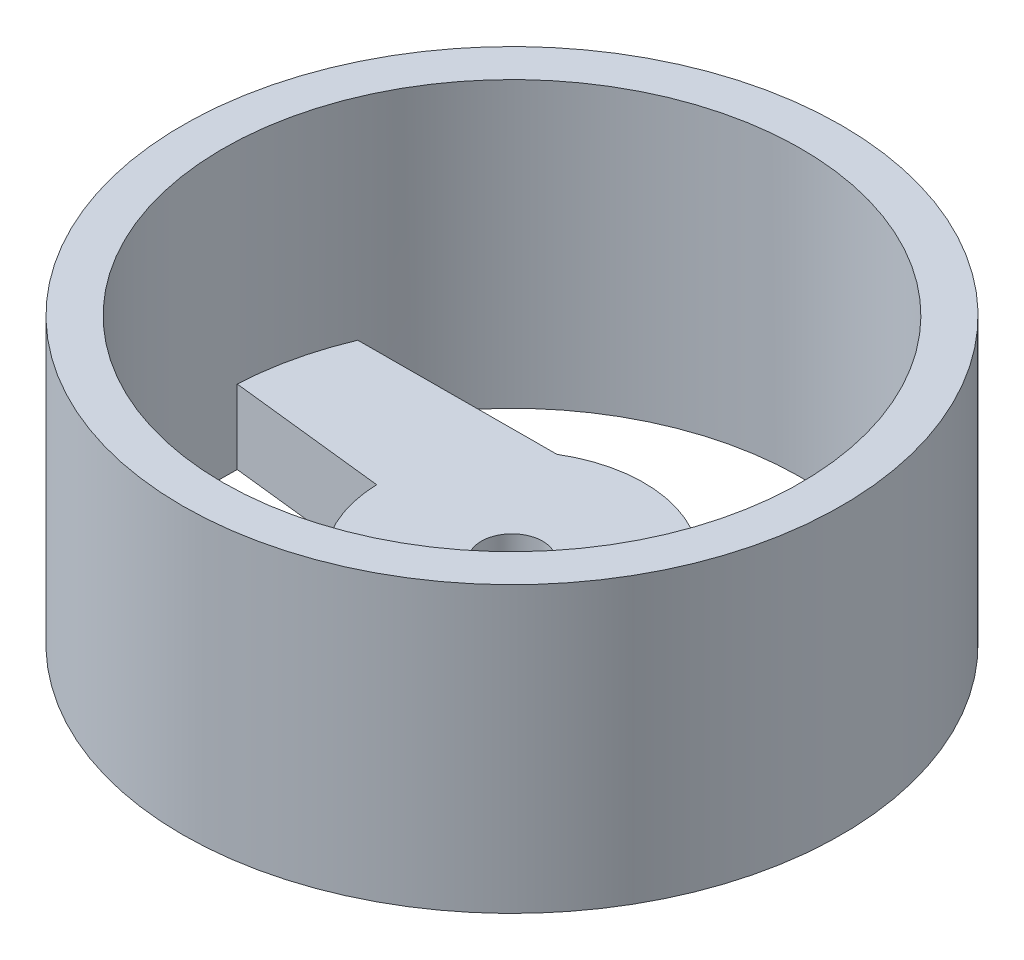
ISO-10303-21;
HEADER;
FILE_DESCRIPTION(('STEP AP214'),'2;1');
FILE_NAME('part.step','',(''),(''),'','','');
FILE_SCHEMA(('AUTOMOTIVE_DESIGN { 1 0 10303 214 1 1 1 1 }'));
ENDSEC;
DATA;
#1=APPLICATION_CONTEXT('core data for automotive mechanical design processes');
#2=APPLICATION_PROTOCOL_DEFINITION('international standard','automotive_design',2000,#1);
#3=PRODUCT_CONTEXT('',#1,'mechanical');
#4=PRODUCT('Part','Part','',(#3));
#5=PRODUCT_RELATED_PRODUCT_CATEGORY('part','',(#4));
#6=PRODUCT_DEFINITION_FORMATION('','',#4);
#7=PRODUCT_DEFINITION_CONTEXT('part definition',#1,'design');
#8=PRODUCT_DEFINITION('design','',#6,#7);
#9=PRODUCT_DEFINITION_SHAPE('','',#8);
#10=(LENGTH_UNIT() NAMED_UNIT(*) SI_UNIT(.MILLI.,.METRE.));
#11=(NAMED_UNIT(*) PLANE_ANGLE_UNIT() SI_UNIT($,.RADIAN.));
#12=(NAMED_UNIT(*) SI_UNIT($,.STERADIAN.) SOLID_ANGLE_UNIT());
#13=UNCERTAINTY_MEASURE_WITH_UNIT(LENGTH_MEASURE(1.E-05),#10,'distance_accuracy_value','');
#14=(GEOMETRIC_REPRESENTATION_CONTEXT(3) GLOBAL_UNCERTAINTY_ASSIGNED_CONTEXT((#13)) GLOBAL_UNIT_ASSIGNED_CONTEXT((#10,
#11,#12)) REPRESENTATION_CONTEXT('',''));
#15=CARTESIAN_POINT('',(0.,0.,0.));
#16=DIRECTION('',(0.,0.,1.));
#17=DIRECTION('',(1.,0.,0.));
#18=AXIS2_PLACEMENT_3D('',#15,#16,#17);
#19=CARTESIAN_POINT('',(0.,10.9450354666916,0.));
#20=DIRECTION('',(0.,-1.,0.));
#21=DIRECTION('',(0.,0.,-1.));
#22=AXIS2_PLACEMENT_3D('',#19,#20,#21);
#23=CYLINDRICAL_SURFACE('',#22,2.47678331171608);
#24=CARTESIAN_POINT('',(0.,6.68550106506643,0.));
#25=DIRECTION('',(0.,1.,0.));
#26=DIRECTION('',(0.,0.,1.));
#27=AXIS2_PLACEMENT_3D('',#24,#25,#26);
#28=CIRCLE('',#27,2.47678331171608);
#29=CARTESIAN_POINT('',(1.29408330446736,6.68550106506643,2.11182479725334));
#30=VERTEX_POINT('',#29);
#31=CARTESIAN_POINT('',(2.47636387261976,6.68550106506643,-0.0455800787511907));
#32=VERTEX_POINT('',#31);
#33=EDGE_CURVE('E255',#30,#32,#28,.T.);
#34=ORIENTED_EDGE('',*,*,#33,.F.);
#35=DIRECTION('',(0.,-1.,0.));
#36=VECTOR('',#35,1.);
#37=CARTESIAN_POINT('',(1.29408330446736,10.9450354666916,2.11182479725334));
#38=LINE('',#37,#36);
#39=CARTESIAN_POINT('',(1.29408330446736,5.29503546669157,2.11182479725334));
#40=VERTEX_POINT('',#39);
#41=EDGE_CURVE('E175',#30,#40,#38,.T.);
#42=ORIENTED_EDGE('',*,*,#41,.T.);
#43=CARTESIAN_POINT('',(0.,5.29503546669157,0.));
#44=DIRECTION('',(0.,1.,0.));
#45=DIRECTION('',(0.,0.,1.));
#46=AXIS2_PLACEMENT_3D('',#43,#44,#45);
#47=CIRCLE('',#46,2.47678331171608);
#48=CARTESIAN_POINT('',(2.47636387261976,5.29503546669157,-0.0455800787511908));
#49=VERTEX_POINT('',#48);
#50=EDGE_CURVE('E161',#40,#49,#47,.T.);
#51=ORIENTED_EDGE('',*,*,#50,.T.);
#52=DIRECTION('',(0.,-1.,0.));
#53=VECTOR('',#52,1.);
#54=CARTESIAN_POINT('',(2.47636387261976,10.9450354666916,-0.0455800787511906));
#55=LINE('',#54,#53);
#56=EDGE_CURVE('E174',#32,#49,#55,.T.);
#57=ORIENTED_EDGE('',*,*,#56,.F.);
#58=EDGE_LOOP('',(#34,#42,#51,#57));
#59=FACE_BOUND('',#58,.T.);
#60=ADVANCED_FACE('F36',(#59),#23,.T.);
#61=CARTESIAN_POINT('',(1.29408330446736,10.9450354666916,2.11182479725334));
#62=DIRECTION('',(0.916042255371036,0.,-0.401081770185015));
#63=DIRECTION('',(-0.401081770185015,0.,-0.916042255371036));
#64=AXIS2_PLACEMENT_3D('',#61,#62,#63);
#65=PLANE('',#64);
#66=ORIENTED_EDGE('',*,*,#41,.F.);
#67=DIRECTION('',(0.401081770185015,0.,0.916042255371036));
#68=VECTOR('',#67,1.);
#69=CARTESIAN_POINT('',(1.29408330446736,6.68550106506643,2.11182479725334));
#70=LINE('',#69,#68);
#71=CARTESIAN_POINT('',(2.48301090618014,6.68550106506643,4.82725093403201));
#72=VERTEX_POINT('',#71);
#73=EDGE_CURVE('E256',#30,#72,#70,.T.);
#74=ORIENTED_EDGE('',*,*,#73,.T.);
#75=DIRECTION('',(0.,-1.,0.));
#76=VECTOR('',#75,1.);
#77=CARTESIAN_POINT('',(2.48301090618014,10.9450354666916,4.82725093403201));
#78=LINE('',#77,#76);
#79=CARTESIAN_POINT('',(2.48301090618014,5.29503546669157,4.82725093403201));
#80=VERTEX_POINT('',#79);
#81=EDGE_CURVE('E144',#72,#80,#78,.T.);
#82=ORIENTED_EDGE('',*,*,#81,.T.);
#83=DIRECTION('',(0.401081770185015,0.,0.916042255371036));
#84=VECTOR('',#83,1.);
#85=CARTESIAN_POINT('',(1.29408330446736,5.29503546669157,2.11182479725334));
#86=LINE('',#85,#84);
#87=EDGE_CURVE('E171',#40,#80,#86,.T.);
#88=ORIENTED_EDGE('',*,*,#87,.F.);
#89=EDGE_LOOP('',(#66,#74,#82,#88));
#90=FACE_BOUND('',#89,.T.);
#91=ADVANCED_FACE('F210',(#90),#65,.T.);
#92=CARTESIAN_POINT('',(2.47636387261976,10.9450354666916,-0.0455800787511906));
#93=DIRECTION('',(-0.867982307981764,0.,-0.496595119821621));
#94=DIRECTION('',(-0.496595119821621,0.,0.867982307981764));
#95=AXIS2_PLACEMENT_3D('',#92,#93,#94);
#96=PLANE('',#95);
#97=DIRECTION('',(0.496595119821621,0.,-0.867982307981764));
#98=VECTOR('',#97,1.);
#99=CARTESIAN_POINT('',(2.47636387261976,6.68550106506643,-0.0455800787511916));
#100=LINE('',#99,#98);
#101=CARTESIAN_POINT('',(4.32624199026295,6.68550106506643,-3.27892131378722));
#102=VERTEX_POINT('',#101);
#103=EDGE_CURVE('E262',#32,#102,#100,.T.);
#104=ORIENTED_EDGE('',*,*,#103,.F.);
#105=ORIENTED_EDGE('',*,*,#56,.T.);
#106=DIRECTION('',(0.496595119821621,0.,-0.867982307981764));
#107=VECTOR('',#106,1.);
#108=CARTESIAN_POINT('',(2.47636387261976,5.29503546669157,-0.0455800787511919));
#109=LINE('',#108,#107);
#110=CARTESIAN_POINT('',(4.32624199026295,5.29503546669157,-3.27892131378722));
#111=VERTEX_POINT('',#110);
#112=EDGE_CURVE('E164',#49,#111,#109,.T.);
#113=ORIENTED_EDGE('',*,*,#112,.T.);
#114=DIRECTION('',(0.,-1.,0.));
#115=VECTOR('',#114,1.);
#116=CARTESIAN_POINT('',(4.32624199026295,10.9450354666916,-3.27892131378722));
#117=LINE('',#116,#115);
#118=EDGE_CURVE('E179',#102,#111,#117,.T.);
#119=ORIENTED_EDGE('',*,*,#118,.F.);
#120=EDGE_LOOP('',(#104,#105,#113,#119));
#121=FACE_BOUND('',#120,.T.);
#122=ADVANCED_FACE('F216',(#121),#96,.F.);
#123=CARTESIAN_POINT('',(0.,10.9450354666916,0.));
#124=DIRECTION('',(0.,-1.,0.));
#125=DIRECTION('',(0.,0.,-1.));
#126=AXIS2_PLACEMENT_3D('',#123,#124,#125);
#127=CYLINDRICAL_SURFACE('',#126,2.47678331171608);
#128=CARTESIAN_POINT('',(0.,6.68550106506643,0.));
#129=DIRECTION('',(0.,1.,0.));
#130=DIRECTION('',(0.,0.,1.));
#131=AXIS2_PLACEMENT_3D('',#128,#129,#130);
#132=CIRCLE('',#131,2.47678331171608);
#133=CARTESIAN_POINT('',(-2.475935574997,6.68550106506643,0.0647966176554004));
#134=VERTEX_POINT('',#133);
#135=CARTESIAN_POINT('',(-1.19870843020483,6.68550106506643,2.16738406207833));
#136=VERTEX_POINT('',#135);
#137=EDGE_CURVE('E130',#134,#136,#132,.T.);
#138=ORIENTED_EDGE('',*,*,#137,.F.);
#139=DIRECTION('',(0.,-1.,0.));
#140=VECTOR('',#139,1.);
#141=CARTESIAN_POINT('',(-2.475935574997,10.9450354666916,0.0647966176554011));
#142=LINE('',#141,#140);
#143=CARTESIAN_POINT('',(-2.475935574997,5.29503546669157,0.0647966176553998));
#144=VERTEX_POINT('',#143);
#145=EDGE_CURVE('E155',#134,#144,#142,.T.);
#146=ORIENTED_EDGE('',*,*,#145,.T.);
#147=CARTESIAN_POINT('',(0.,5.29503546669157,0.));
#148=DIRECTION('',(0.,1.,0.));
#149=DIRECTION('',(-0.866025403784443,0.,-0.499999999999992));
#150=AXIS2_PLACEMENT_3D('',#147,#148,#149);
#151=CIRCLE('',#150,2.47678331171608);
#152=CARTESIAN_POINT('',(-1.19870843020483,5.29503546669157,2.16738406207833));
#153=VERTEX_POINT('',#152);
#154=EDGE_CURVE('E244',#144,#153,#151,.T.);
#155=ORIENTED_EDGE('',*,*,#154,.T.);
#156=DIRECTION('',(0.,-1.,0.));
#157=VECTOR('',#156,1.);
#158=CARTESIAN_POINT('',(-1.19870843020483,10.9450354666916,2.16738406207833));
#159=LINE('',#158,#157);
#160=EDGE_CURVE('E153',#136,#153,#159,.T.);
#161=ORIENTED_EDGE('',*,*,#160,.F.);
#162=EDGE_LOOP('',(#138,#146,#155,#161));
#163=FACE_BOUND('',#162,.T.);
#164=ADVANCED_FACE('F292',(#163),#127,.T.);
#165=CARTESIAN_POINT('',(-2.475935574997,10.9450354666916,0.0647966176554011));
#166=DIRECTION('',(-0.110674125710453,0.,0.993856749183818));
#167=DIRECTION('',(0.993856749183818,0.,0.110674125710454));
#168=AXIS2_PLACEMENT_3D('',#165,#166,#167);
#169=PLANE('',#168);
#170=ORIENTED_EDGE('',*,*,#145,.F.);
#171=DIRECTION('',(-0.993856749183818,0.,-0.110674125710454));
#172=VECTOR('',#171,1.);
#173=CARTESIAN_POINT('',(-2.475935574997,6.68550106506643,0.0647966176554002));
#174=LINE('',#173,#172);
#175=CARTESIAN_POINT('',(-5.42202739240396,6.68550106506643,-0.263274944390138));
#176=VERTEX_POINT('',#175);
#177=EDGE_CURVE('E263',#134,#176,#174,.T.);
#178=ORIENTED_EDGE('',*,*,#177,.T.);
#179=DIRECTION('',(0.,-1.,0.));
#180=VECTOR('',#179,1.);
#181=CARTESIAN_POINT('',(-5.42202739240395,10.9450354666916,-0.263274944390137));
#182=LINE('',#181,#180);
#183=CARTESIAN_POINT('',(-5.42202739240395,5.29503546669157,-0.263274944390139));
#184=VERTEX_POINT('',#183);
#185=EDGE_CURVE('E152',#176,#184,#182,.T.);
#186=ORIENTED_EDGE('',*,*,#185,.T.);
#187=DIRECTION('',(-0.993856749183818,0.,-0.110674125710453));
#188=VECTOR('',#187,1.);
#189=CARTESIAN_POINT('',(-2.475935574997,5.29503546669157,0.0647966176553998));
#190=LINE('',#189,#188);
#191=EDGE_CURVE('E157',#144,#184,#190,.T.);
#192=ORIENTED_EDGE('',*,*,#191,.F.);
#193=EDGE_LOOP('',(#170,#178,#186,#192));
#194=FACE_BOUND('',#193,.T.);
#195=ADVANCED_FACE('F294',(#194),#169,.T.);
#196=CARTESIAN_POINT('',(-1.19870843020483,10.9450354666916,2.16738406207833));
#197=DIRECTION('',(0.864055143151778,0.,-0.503397168836854));
#198=DIRECTION('',(-0.503397168836854,0.,-0.864055143151778));
#199=AXIS2_PLACEMENT_3D('',#196,#197,#198);
#200=PLANE('',#199);
#201=DIRECTION('',(0.503397168836854,0.,0.864055143151778));
#202=VECTOR('',#201,1.);
#203=CARTESIAN_POINT('',(-1.19870843020483,6.68550106506643,2.16738406207833));
#204=LINE('',#203,#202);
#205=CARTESIAN_POINT('',(0.67650815961855,6.68550106506643,5.38609612338027));
#206=VERTEX_POINT('',#205);
#207=EDGE_CURVE('E124',#136,#206,#204,.T.);
#208=ORIENTED_EDGE('',*,*,#207,.F.);
#209=ORIENTED_EDGE('',*,*,#160,.T.);
#210=DIRECTION('',(0.503397168836854,0.,0.864055143151778));
#211=VECTOR('',#210,1.);
#212=CARTESIAN_POINT('',(-1.19870843020483,5.29503546669157,2.16738406207833));
#213=LINE('',#212,#211);
#214=CARTESIAN_POINT('',(0.676508159618547,5.29503546669157,5.38609612338027));
#215=VERTEX_POINT('',#214);
#216=EDGE_CURVE('E150',#153,#215,#213,.T.);
#217=ORIENTED_EDGE('',*,*,#216,.T.);
#218=DIRECTION('',(0.,-1.,0.));
#219=VECTOR('',#218,1.);
#220=CARTESIAN_POINT('',(0.676508159618547,10.9450354666916,5.38609612338027));
#221=LINE('',#220,#219);
#222=EDGE_CURVE('E141',#206,#215,#221,.T.);
#223=ORIENTED_EDGE('',*,*,#222,.F.);
#224=EDGE_LOOP('',(#208,#209,#217,#223));
#225=FACE_BOUND('',#224,.T.);
#226=ADVANCED_FACE('F148',(#225),#200,.F.);
#227=CARTESIAN_POINT('',(0.,10.9450354666916,0.));
#228=DIRECTION('',(0.,-1.,0.));
#229=DIRECTION('',(0.,0.,-1.));
#230=AXIS2_PLACEMENT_3D('',#227,#228,#229);
#231=CYLINDRICAL_SURFACE('',#230,2.47678331171608);
#232=CARTESIAN_POINT('',(0.,6.68550106506643,0.));
#233=DIRECTION('',(0.,1.,0.));
#234=DIRECTION('',(0.,0.,1.));
#235=AXIS2_PLACEMENT_3D('',#232,#233,#234);
#236=CIRCLE('',#235,2.47678331171608);
#237=CARTESIAN_POINT('',(1.18185227052962,6.68550106506643,-2.17662141490873));
#238=VERTEX_POINT('',#237);
#239=CARTESIAN_POINT('',(-1.27765544241491,6.68550106506643,-2.12180398332712));
#240=VERTEX_POINT('',#239);
#241=EDGE_CURVE('E51',#238,#240,#236,.T.);
#242=ORIENTED_EDGE('',*,*,#241,.F.);
#243=DIRECTION('',(0.,-1.,0.));
#244=VECTOR('',#243,1.);
#245=CARTESIAN_POINT('',(1.18185227052962,10.9450354666916,-2.17662141490873));
#246=LINE('',#245,#244);
#247=CARTESIAN_POINT('',(1.18185227052962,5.29503546669157,-2.17662141490873));
#248=VERTEX_POINT('',#247);
#249=EDGE_CURVE('E165',#238,#248,#246,.T.);
#250=ORIENTED_EDGE('',*,*,#249,.T.);
#251=CARTESIAN_POINT('',(0.,5.29503546669157,0.));
#252=DIRECTION('',(0.,1.,0.));
#253=DIRECTION('',(0.866025403784436,0.,-0.500000000000004));
#254=AXIS2_PLACEMENT_3D('',#251,#252,#253);
#255=CIRCLE('',#254,2.47678331171608);
#256=CARTESIAN_POINT('',(-1.27765544241491,5.29503546669157,-2.12180398332712));
#257=VERTEX_POINT('',#256);
#258=EDGE_CURVE('E239',#248,#257,#255,.T.);
#259=ORIENTED_EDGE('',*,*,#258,.T.);
#260=DIRECTION('',(0.,-1.,0.));
#261=VECTOR('',#260,1.);
#262=CARTESIAN_POINT('',(-1.27765544241491,10.9450354666916,-2.12180398332712));
#263=LINE('',#262,#261);
#264=EDGE_CURVE('E58',#240,#257,#263,.T.);
#265=ORIENTED_EDGE('',*,*,#264,.F.);
#266=EDGE_LOOP('',(#242,#250,#259,#265));
#267=FACE_BOUND('',#266,.T.);
#268=ADVANCED_FACE('F324',(#267),#231,.T.);
#269=CARTESIAN_POINT('',(1.18185227052962,10.9450354666916,-2.17662141490873));
#270=DIRECTION('',(-0.805368129660576,0.,-0.592774978998798));
#271=DIRECTION('',(-0.592774978998798,0.,0.805368129660576));
#272=AXIS2_PLACEMENT_3D('',#269,#270,#271);
#273=PLANE('',#272);
#274=ORIENTED_EDGE('',*,*,#249,.F.);
#275=DIRECTION('',(0.592774978998798,0.,-0.805368129660576));
#276=VECTOR('',#275,1.);
#277=CARTESIAN_POINT('',(1.18185227052962,6.68550106506643,-2.17662141490873));
#278=LINE('',#277,#276);
#279=CARTESIAN_POINT('',(2.93901648622379,6.68550106506643,-4.56397598964184));
#280=VERTEX_POINT('',#279);
#281=EDGE_CURVE('E134',#238,#280,#278,.T.);
#282=ORIENTED_EDGE('',*,*,#281,.T.);
#283=DIRECTION('',(0.,-1.,0.));
#284=VECTOR('',#283,1.);
#285=CARTESIAN_POINT('',(2.93901648622379,10.9450354666916,-4.56397598964184));
#286=LINE('',#285,#284);
#287=CARTESIAN_POINT('',(2.93901648622379,5.29503546669157,-4.56397598964184));
#288=VERTEX_POINT('',#287);
#289=EDGE_CURVE('E280',#280,#288,#286,.T.);
#290=ORIENTED_EDGE('',*,*,#289,.T.);
#291=DIRECTION('',(0.592774978998798,0.,-0.805368129660576));
#292=VECTOR('',#291,1.);
#293=CARTESIAN_POINT('',(1.18185227052962,5.29503546669157,-2.17662141490873));
#294=LINE('',#293,#292);
#295=EDGE_CURVE('E277',#248,#288,#294,.T.);
#296=ORIENTED_EDGE('',*,*,#295,.F.);
#297=EDGE_LOOP('',(#274,#282,#290,#296));
#298=FACE_BOUND('',#297,.T.);
#299=ADVANCED_FACE('F207',(#298),#273,.T.);
#300=CARTESIAN_POINT('',(-1.27765544241491,10.9450354666916,-2.12180398332712));
#301=DIRECTION('',(0.00392716482998567,0.,0.999992288658467));
#302=DIRECTION('',(0.999992288658467,0.,-0.00392716482998567));
#303=AXIS2_PLACEMENT_3D('',#300,#301,#302);
#304=PLANE('',#303);
#305=DIRECTION('',(-0.999992288658467,0.,0.00392716482998567));
#306=VECTOR('',#305,1.);
#307=CARTESIAN_POINT('',(-1.27765544241491,6.68550106506643,-2.12180398332712));
#308=LINE('',#307,#306);
#309=CARTESIAN_POINT('',(-5.00275014988147,6.68550106506643,-2.10717480959304));
#310=VERTEX_POINT('',#309);
#311=EDGE_CURVE('E11',#240,#310,#308,.T.);
#312=ORIENTED_EDGE('',*,*,#311,.F.);
#313=ORIENTED_EDGE('',*,*,#264,.T.);
#314=DIRECTION('',(-0.999992288658467,0.,0.00392716482998567));
#315=VECTOR('',#314,1.);
#316=CARTESIAN_POINT('',(-1.27765544241491,5.29503546669157,-2.12180398332712));
#317=LINE('',#316,#315);
#318=CARTESIAN_POINT('',(-5.00275014988146,5.29503546669157,-2.10717480959304));
#319=VERTEX_POINT('',#318);
#320=EDGE_CURVE('E272',#257,#319,#317,.T.);
#321=ORIENTED_EDGE('',*,*,#320,.T.);
#322=DIRECTION('',(0.,-1.,0.));
#323=VECTOR('',#322,1.);
#324=CARTESIAN_POINT('',(-5.00275014988146,10.9450354666916,-2.10717480959304));
#325=LINE('',#324,#323);
#326=EDGE_CURVE('E282',#310,#319,#325,.T.);
#327=ORIENTED_EDGE('',*,*,#326,.F.);
#328=EDGE_LOOP('',(#312,#313,#321,#327));
#329=FACE_BOUND('',#328,.T.);
#330=ADVANCED_FACE('F199',(#329),#304,.F.);
#331=CARTESIAN_POINT('',(0.,5.29503546669157,0.));
#332=DIRECTION('',(0.,1.,0.));
#333=DIRECTION('',(0.,0.,1.));
#334=AXIS2_PLACEMENT_3D('',#331,#332,#333);
#335=CYLINDRICAL_SURFACE('',#334,6.18728670384542);
#336=CARTESIAN_POINT('',(0.,5.29503546669157,0.));
#337=DIRECTION('',(0.,1.,0.));
#338=DIRECTION('',(0.,0.,1.));
#339=AXIS2_PLACEMENT_3D('',#336,#337,#338);
#340=CIRCLE('',#339,6.18728670384541);
#341=CARTESIAN_POINT('',(0.,5.29503546669157,6.18728670384541));
#342=VERTEX_POINT('',#341);
#343=EDGE_CURVE('E187',#342,#342,#340,.T.);
#344=ORIENTED_EDGE('',*,*,#343,.T.);
#345=EDGE_LOOP('',(#344));
#346=FACE_BOUND('',#345,.T.);
#347=CARTESIAN_POINT('',(0.,10.6405010650664,0.));
#348=DIRECTION('',(0.,1.,0.));
#349=DIRECTION('',(0.,0.,1.));
#350=AXIS2_PLACEMENT_3D('',#347,#348,#349);
#351=CIRCLE('',#350,6.18728670384542);
#352=CARTESIAN_POINT('',(0.,10.6405010650664,6.18728670384541));
#353=VERTEX_POINT('',#352);
#354=EDGE_CURVE('E190',#353,#353,#351,.T.);
#355=ORIENTED_EDGE('',*,*,#354,.F.);
#356=EDGE_LOOP('',(#355));
#357=FACE_BOUND('',#356,.T.);
#358=ADVANCED_FACE('F38',(#346,#357),#335,.T.);
#359=CARTESIAN_POINT('',(0.,10.6405010650664,0.));
#360=DIRECTION('',(0.,1.,0.));
#361=DIRECTION('',(0.,0.,1.));
#362=AXIS2_PLACEMENT_3D('',#359,#360,#361);
#363=PLANE('',#362);
#364=CARTESIAN_POINT('',(0.,10.6405010650664,0.));
#365=DIRECTION('',(0.,1.,0.));
#366=DIRECTION('',(0.,0.,1.));
#367=AXIS2_PLACEMENT_3D('',#364,#365,#366);
#368=CIRCLE('',#367,5.42841549075994);
#369=CARTESIAN_POINT('',(0.,10.6405010650664,5.42841549075994));
#370=VERTEX_POINT('',#369);
#371=EDGE_CURVE('E177',#370,#370,#368,.F.);
#372=ORIENTED_EDGE('',*,*,#371,.T.);
#373=EDGE_LOOP('',(#372));
#374=FACE_BOUND('',#373,.T.);
#375=ORIENTED_EDGE('',*,*,#354,.T.);
#376=EDGE_LOOP('',(#375));
#377=FACE_BOUND('',#376,.T.);
#378=ADVANCED_FACE('F196',(#374,#377),#363,.T.);
#379=CARTESIAN_POINT('',(6.18728670384541,5.29503546669157,0.));
#380=DIRECTION('',(0.,-1.,0.));
#381=DIRECTION('',(0.,0.,-1.));
#382=AXIS2_PLACEMENT_3D('',#379,#380,#381);
#383=PLANE('',#382);
#384=ORIENTED_EDGE('',*,*,#258,.F.);
#385=ORIENTED_EDGE('',*,*,#295,.T.);
#386=CARTESIAN_POINT('',(0.,5.29503546669157,0.));
#387=DIRECTION('',(0.,1.,0.));
#388=DIRECTION('',(0.866025403784436,0.,-0.500000000000004));
#389=AXIS2_PLACEMENT_3D('',#386,#387,#388);
#390=CIRCLE('',#389,5.42841549075994);
#391=EDGE_CURVE('E274',#288,#319,#390,.T.);
#392=ORIENTED_EDGE('',*,*,#391,.T.);
#393=ORIENTED_EDGE('',*,*,#320,.F.);
#394=EDGE_LOOP('',(#384,#385,#392,#393));
#395=FACE_BOUND('',#394,.T.);
#396=ORIENTED_EDGE('',*,*,#154,.F.);
#397=ORIENTED_EDGE('',*,*,#191,.T.);
#398=CARTESIAN_POINT('',(0.,5.29503546669157,0.));
#399=DIRECTION('',(0.,1.,0.));
#400=DIRECTION('',(-0.866025403784443,0.,-0.499999999999992));
#401=AXIS2_PLACEMENT_3D('',#398,#399,#400);
#402=CIRCLE('',#401,5.42841549075994);
#403=EDGE_CURVE('E287',#184,#215,#402,.T.);
#404=ORIENTED_EDGE('',*,*,#403,.T.);
#405=ORIENTED_EDGE('',*,*,#216,.F.);
#406=EDGE_LOOP('',(#396,#397,#404,#405));
#407=FACE_BOUND('',#406,.T.);
#408=ORIENTED_EDGE('',*,*,#50,.F.);
#409=ORIENTED_EDGE('',*,*,#87,.T.);
#410=CARTESIAN_POINT('',(0.,5.29503546669157,0.));
#411=DIRECTION('',(0.,1.,0.));
#412=DIRECTION('',(0.,0.,1.));
#413=AXIS2_PLACEMENT_3D('',#410,#411,#412);
#414=CIRCLE('',#413,5.42841549075994);
#415=EDGE_CURVE('E168',#80,#111,#414,.T.);
#416=ORIENTED_EDGE('',*,*,#415,.T.);
#417=ORIENTED_EDGE('',*,*,#112,.F.);
#418=EDGE_LOOP('',(#408,#409,#416,#417));
#419=FACE_BOUND('',#418,.T.);
#420=CARTESIAN_POINT('',(0.,5.29503546669157,0.));
#421=DIRECTION('',(0.,-1.,0.));
#422=DIRECTION('',(0.,0.,-1.));
#423=AXIS2_PLACEMENT_3D('',#420,#421,#422);
#424=CIRCLE('',#423,2.26);
#425=CARTESIAN_POINT('',(0.,5.29503546669157,-2.26));
#426=VERTEX_POINT('',#425);
#427=EDGE_CURVE('E45',#426,#426,#424,.T.);
#428=ORIENTED_EDGE('',*,*,#427,.F.);
#429=EDGE_LOOP('',(#428));
#430=FACE_BOUND('',#429,.T.);
#431=ORIENTED_EDGE('',*,*,#343,.F.);
#432=EDGE_LOOP('',(#431));
#433=FACE_BOUND('',#432,.T.);
#434=ADVANCED_FACE('F205',(#395,#407,#419,#430,#433),#383,.T.);
#435=CARTESIAN_POINT('',(0.,3.03503546669157,0.));
#436=DIRECTION('',(0.,1.,0.));
#437=DIRECTION('',(0.,0.,1.));
#438=AXIS2_PLACEMENT_3D('',#435,#436,#437);
#439=CYLINDRICAL_SURFACE('',#438,2.26);
#440=CARTESIAN_POINT('',(0.,3.03503546669157,0.));
#441=DIRECTION('',(0.,-1.,0.));
#442=DIRECTION('',(0.,0.,-1.));
#443=AXIS2_PLACEMENT_3D('',#440,#441,#442);
#444=CIRCLE('',#443,2.26);
#445=CARTESIAN_POINT('',(0.,3.03503546669157,-2.26));
#446=VERTEX_POINT('',#445);
#447=EDGE_CURVE('E184',#446,#446,#444,.T.);
#448=ORIENTED_EDGE('',*,*,#447,.F.);
#449=EDGE_LOOP('',(#448));
#450=FACE_BOUND('',#449,.T.);
#451=ORIENTED_EDGE('',*,*,#427,.T.);
#452=EDGE_LOOP('',(#451));
#453=FACE_BOUND('',#452,.T.);
#454=ADVANCED_FACE('F226',(#450,#453),#439,.T.);
#455=CARTESIAN_POINT('',(0.,3.03503546669157,0.));
#456=DIRECTION('',(0.,-1.,0.));
#457=DIRECTION('',(0.,0.,-1.));
#458=AXIS2_PLACEMENT_3D('',#455,#456,#457);
#459=PLANE('',#458);
#460=CARTESIAN_POINT('',(0.,3.03503546669157,0.));
#461=DIRECTION('',(0.,-1.,0.));
#462=DIRECTION('',(0.,0.,-1.));
#463=AXIS2_PLACEMENT_3D('',#460,#461,#462);
#464=CIRCLE('',#463,0.576132234997036);
#465=CARTESIAN_POINT('',(0.,3.03503546669157,-0.576132234997039));
#466=VERTEX_POINT('',#465);
#467=EDGE_CURVE('E306',#466,#466,#464,.T.);
#468=ORIENTED_EDGE('',*,*,#467,.F.);
#469=EDGE_LOOP('',(#468));
#470=FACE_BOUND('',#469,.T.);
#471=ORIENTED_EDGE('',*,*,#447,.T.);
#472=EDGE_LOOP('',(#471));
#473=FACE_BOUND('',#472,.T.);
#474=ADVANCED_FACE('F223',(#470,#473),#459,.T.);
#475=CARTESIAN_POINT('',(0.,10.9450354666916,0.));
#476=DIRECTION('',(0.,-1.,0.));
#477=DIRECTION('',(0.,0.,-1.));
#478=AXIS2_PLACEMENT_3D('',#475,#476,#477);
#479=CYLINDRICAL_SURFACE('',#478,5.42841549075994);
#480=ORIENTED_EDGE('',*,*,#81,.F.);
#481=CARTESIAN_POINT('',(0.,6.68550106506643,0.));
#482=DIRECTION('',(0.,1.,0.));
#483=DIRECTION('',(0.,0.,1.));
#484=AXIS2_PLACEMENT_3D('',#481,#482,#483);
#485=CIRCLE('',#484,5.42841549075994);
#486=EDGE_CURVE('E127',#206,#72,#485,.T.);
#487=ORIENTED_EDGE('',*,*,#486,.F.);
#488=ORIENTED_EDGE('',*,*,#222,.T.);
#489=ORIENTED_EDGE('',*,*,#403,.F.);
#490=ORIENTED_EDGE('',*,*,#185,.F.);
#491=EDGE_CURVE('E147',#310,#176,#485,.T.);
#492=ORIENTED_EDGE('',*,*,#491,.F.);
#493=ORIENTED_EDGE('',*,*,#326,.T.);
#494=ORIENTED_EDGE('',*,*,#391,.F.);
#495=ORIENTED_EDGE('',*,*,#289,.F.);
#496=EDGE_CURVE('E145',#102,#280,#485,.T.);
#497=ORIENTED_EDGE('',*,*,#496,.F.);
#498=ORIENTED_EDGE('',*,*,#118,.T.);
#499=ORIENTED_EDGE('',*,*,#415,.F.);
#500=EDGE_LOOP('',(#480,#487,#488,#489,#490,#492,#493,#494,#495,#497,#498,#499));
#501=FACE_BOUND('',#500,.T.);
#502=ORIENTED_EDGE('',*,*,#371,.F.);
#503=EDGE_LOOP('',(#502));
#504=FACE_BOUND('',#503,.T.);
#505=ADVANCED_FACE('F138',(#501,#504),#479,.F.);
#506=CARTESIAN_POINT('',(0.,6.68550106506643,0.));
#507=DIRECTION('',(0.,1.,0.));
#508=DIRECTION('',(0.,0.,1.));
#509=AXIS2_PLACEMENT_3D('',#506,#507,#508);
#510=PLANE('',#509);
#511=CARTESIAN_POINT('',(0.,6.68550106506643,0.));
#512=DIRECTION('',(0.,1.,0.));
#513=DIRECTION('',(0.,0.,1.));
#514=AXIS2_PLACEMENT_3D('',#511,#512,#513);
#515=CIRCLE('',#514,0.576132234997036);
#516=CARTESIAN_POINT('',(0.,6.68550106506643,0.576132234997034));
#517=VERTEX_POINT('',#516);
#518=EDGE_CURVE('E40',#517,#517,#515,.T.);
#519=ORIENTED_EDGE('',*,*,#518,.F.);
#520=EDGE_LOOP('',(#519));
#521=FACE_BOUND('',#520,.T.);
#522=ORIENTED_EDGE('',*,*,#33,.T.);
#523=ORIENTED_EDGE('',*,*,#103,.T.);
#524=ORIENTED_EDGE('',*,*,#496,.T.);
#525=ORIENTED_EDGE('',*,*,#281,.F.);
#526=ORIENTED_EDGE('',*,*,#241,.T.);
#527=ORIENTED_EDGE('',*,*,#311,.T.);
#528=ORIENTED_EDGE('',*,*,#491,.T.);
#529=ORIENTED_EDGE('',*,*,#177,.F.);
#530=ORIENTED_EDGE('',*,*,#137,.T.);
#531=ORIENTED_EDGE('',*,*,#207,.T.);
#532=ORIENTED_EDGE('',*,*,#486,.T.);
#533=ORIENTED_EDGE('',*,*,#73,.F.);
#534=EDGE_LOOP('',(#522,#523,#524,#525,#526,#527,#528,#529,#530,#531,#532,#533));
#535=FACE_BOUND('',#534,.T.);
#536=ADVANCED_FACE('F126',(#521,#535),#510,.T.);
#537=CARTESIAN_POINT('',(0.,10.6405010650664,0.));
#538=DIRECTION('',(0.,-1.,0.));
#539=DIRECTION('',(0.,0.,-1.));
#540=AXIS2_PLACEMENT_3D('',#537,#538,#539);
#541=CYLINDRICAL_SURFACE('',#540,0.576132234997036);
#542=ORIENTED_EDGE('',*,*,#518,.T.);
#543=EDGE_LOOP('',(#542));
#544=FACE_BOUND('',#543,.T.);
#545=ORIENTED_EDGE('',*,*,#467,.T.);
#546=EDGE_LOOP('',(#545));
#547=FACE_BOUND('',#546,.T.);
#548=ADVANCED_FACE('F313',(#544,#547),#541,.F.);
#549=CLOSED_SHELL('',(#60,#91,#122,#164,#195,#226,#268,#299,#330,#358,#378,#434,#454,#474,#505,
#536,#548));
#550=MANIFOLD_SOLID_BREP('B2',#549);
#551=ADVANCED_BREP_SHAPE_REPRESENTATION('',(#18,#550),#14);
#552=SHAPE_DEFINITION_REPRESENTATION(#9,#551);
ENDSEC;
END-ISO-10303-21;
